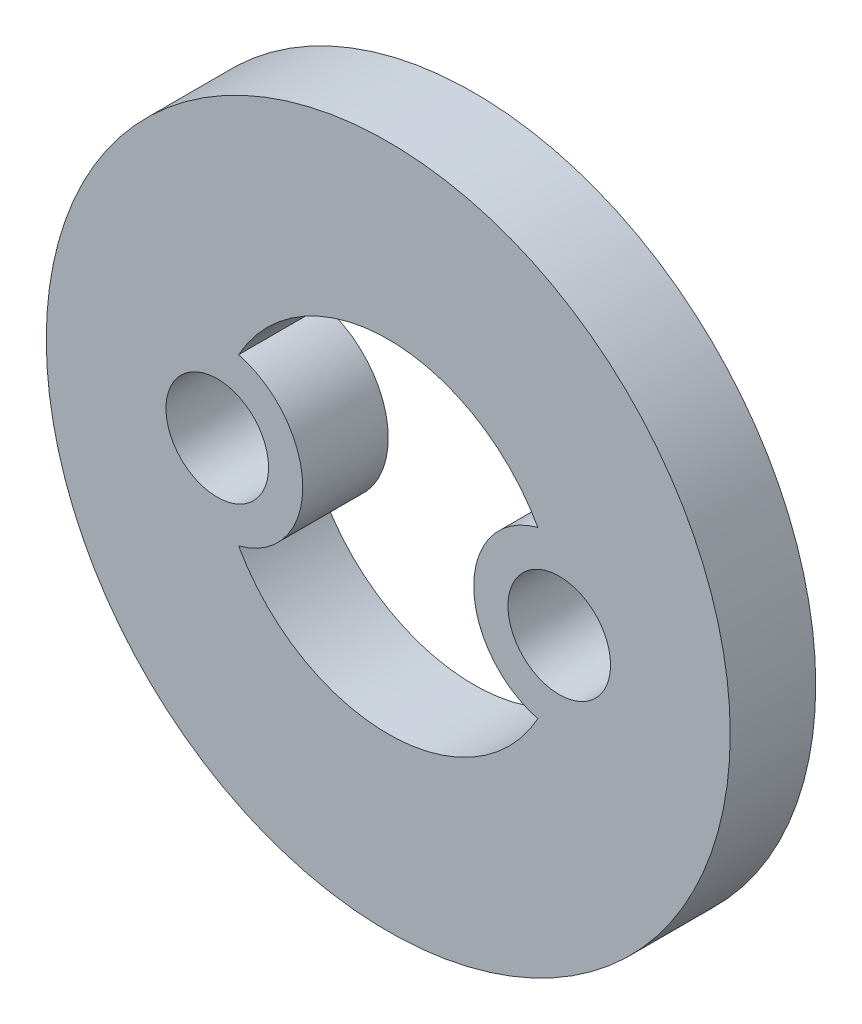
ISO-10303-21;
HEADER;
FILE_DESCRIPTION(('STEP AP214'),'2;1');
FILE_NAME('part.step','',(''),(''),'','','');
FILE_SCHEMA(('AUTOMOTIVE_DESIGN { 1 0 10303 214 1 1 1 1 }'));
ENDSEC;
DATA;
#1=APPLICATION_CONTEXT('core data for automotive mechanical design processes');
#2=APPLICATION_PROTOCOL_DEFINITION('international standard','automotive_design',2000,#1);
#3=PRODUCT_CONTEXT('',#1,'mechanical');
#4=PRODUCT('Part','Part','',(#3));
#5=PRODUCT_RELATED_PRODUCT_CATEGORY('part','',(#4));
#6=PRODUCT_DEFINITION_FORMATION('','',#4);
#7=PRODUCT_DEFINITION_CONTEXT('part definition',#1,'design');
#8=PRODUCT_DEFINITION('design','',#6,#7);
#9=PRODUCT_DEFINITION_SHAPE('','',#8);
#10=(LENGTH_UNIT() NAMED_UNIT(*) SI_UNIT(.MILLI.,.METRE.));
#11=(NAMED_UNIT(*) PLANE_ANGLE_UNIT() SI_UNIT($,.RADIAN.));
#12=(NAMED_UNIT(*) SI_UNIT($,.STERADIAN.) SOLID_ANGLE_UNIT());
#13=UNCERTAINTY_MEASURE_WITH_UNIT(LENGTH_MEASURE(1.E-05),#10,'distance_accuracy_value','');
#14=(GEOMETRIC_REPRESENTATION_CONTEXT(3) GLOBAL_UNCERTAINTY_ASSIGNED_CONTEXT((#13)) GLOBAL_UNIT_ASSIGNED_CONTEXT((#10,
#11,#12)) REPRESENTATION_CONTEXT('',''));
#15=CARTESIAN_POINT('',(0.,0.,0.));
#16=DIRECTION('',(0.,0.,1.));
#17=DIRECTION('',(1.,0.,0.));
#18=AXIS2_PLACEMENT_3D('',#15,#16,#17);
#19=CARTESIAN_POINT('',(0.,0.,5.));
#20=DIRECTION('',(0.,0.,1.));
#21=DIRECTION('',(1.,0.,0.));
#22=AXIS2_PLACEMENT_3D('',#19,#20,#21);
#23=PLANE('',#22);
#24=CARTESIAN_POINT('',(-10.,0.,5.));
#25=DIRECTION('',(0.,0.,1.));
#26=DIRECTION('',(1.,0.,0.));
#27=AXIS2_PLACEMENT_3D('',#24,#25,#26);
#28=CIRCLE('',#27,3.);
#29=CARTESIAN_POINT('',(-7.,0.,5.));
#30=VERTEX_POINT('',#29);
#31=EDGE_CURVE('E109',#30,#30,#28,.T.);
#32=ORIENTED_EDGE('',*,*,#31,.F.);
#33=EDGE_LOOP('',(#32));
#34=FACE_BOUND('',#33,.T.);
#35=CARTESIAN_POINT('',(0.,0.,5.));
#36=DIRECTION('',(0.,0.,1.));
#37=DIRECTION('',(1.,0.,0.));
#38=AXIS2_PLACEMENT_3D('',#35,#36,#37);
#39=CIRCLE('',#38,20.);
#40=CARTESIAN_POINT('',(20.,0.,5.));
#41=VERTEX_POINT('',#40);
#42=EDGE_CURVE('E11',#41,#41,#39,.T.);
#43=ORIENTED_EDGE('',*,*,#42,.T.);
#44=EDGE_LOOP('',(#43));
#45=FACE_BOUND('',#44,.T.);
#46=CARTESIAN_POINT('',(10.,0.,5.));
#47=DIRECTION('',(0.,0.,1.));
#48=DIRECTION('',(1.,0.,0.));
#49=AXIS2_PLACEMENT_3D('',#46,#47,#48);
#50=CIRCLE('',#49,3.);
#51=CARTESIAN_POINT('',(13.,0.,5.));
#52=VERTEX_POINT('',#51);
#53=EDGE_CURVE('E115',#52,#52,#50,.T.);
#54=ORIENTED_EDGE('',*,*,#53,.F.);
#55=EDGE_LOOP('',(#54));
#56=FACE_BOUND('',#55,.T.);
#57=CARTESIAN_POINT('',(10.,0.,5.));
#58=DIRECTION('',(0.,0.,-1.));
#59=DIRECTION('',(1.,0.,0.));
#60=AXIS2_PLACEMENT_3D('',#57,#58,#59);
#61=CIRCLE('',#60,5.);
#62=CARTESIAN_POINT('',(8.75,-4.84122918275927,5.));
#63=VERTEX_POINT('',#62);
#64=CARTESIAN_POINT('',(8.75,4.84122918275927,5.));
#65=VERTEX_POINT('',#64);
#66=EDGE_CURVE('E81',#63,#65,#61,.T.);
#67=ORIENTED_EDGE('',*,*,#66,.F.);
#68=CARTESIAN_POINT('',(0.,0.,5.));
#69=DIRECTION('',(0.,0.,1.));
#70=DIRECTION('',(1.,0.,0.));
#71=AXIS2_PLACEMENT_3D('',#68,#69,#70);
#72=CIRCLE('',#71,10.);
#73=CARTESIAN_POINT('',(-8.75,-4.84122918275927,5.));
#74=VERTEX_POINT('',#73);
#75=EDGE_CURVE('E73',#74,#63,#72,.T.);
#76=ORIENTED_EDGE('',*,*,#75,.F.);
#77=CARTESIAN_POINT('',(-10.,0.,5.));
#78=DIRECTION('',(0.,0.,-1.));
#79=DIRECTION('',(1.,0.,0.));
#80=AXIS2_PLACEMENT_3D('',#77,#78,#79);
#81=CIRCLE('',#80,5.);
#82=CARTESIAN_POINT('',(-8.75,4.84122918275927,5.));
#83=VERTEX_POINT('',#82);
#84=EDGE_CURVE('E95',#83,#74,#81,.T.);
#85=ORIENTED_EDGE('',*,*,#84,.F.);
#86=CARTESIAN_POINT('',(0.,0.,5.));
#87=DIRECTION('',(0.,0.,1.));
#88=DIRECTION('',(1.,0.,0.));
#89=AXIS2_PLACEMENT_3D('',#86,#87,#88);
#90=CIRCLE('',#89,10.);
#91=EDGE_CURVE('E93',#65,#83,#90,.T.);
#92=ORIENTED_EDGE('',*,*,#91,.F.);
#93=EDGE_LOOP('',(#67,#76,#85,#92));
#94=FACE_BOUND('',#93,.T.);
#95=ADVANCED_FACE('F32',(#34,#45,#56,#94),#23,.T.);
#96=CARTESIAN_POINT('',(0.,0.,0.));
#97=DIRECTION('',(0.,0.,1.));
#98=DIRECTION('',(1.,0.,0.));
#99=AXIS2_PLACEMENT_3D('',#96,#97,#98);
#100=PLANE('',#99);
#101=CARTESIAN_POINT('',(-10.,0.,0.));
#102=DIRECTION('',(0.,0.,1.));
#103=DIRECTION('',(1.,0.,0.));
#104=AXIS2_PLACEMENT_3D('',#101,#102,#103);
#105=CIRCLE('',#104,3.);
#106=CARTESIAN_POINT('',(-7.,0.,0.));
#107=VERTEX_POINT('',#106);
#108=EDGE_CURVE('E89',#107,#107,#105,.T.);
#109=ORIENTED_EDGE('',*,*,#108,.T.);
#110=EDGE_LOOP('',(#109));
#111=FACE_BOUND('',#110,.T.);
#112=CARTESIAN_POINT('',(0.,0.,0.));
#113=DIRECTION('',(0.,0.,1.));
#114=DIRECTION('',(1.,0.,0.));
#115=AXIS2_PLACEMENT_3D('',#112,#113,#114);
#116=CIRCLE('',#115,20.);
#117=CARTESIAN_POINT('',(20.,0.,0.));
#118=VERTEX_POINT('',#117);
#119=EDGE_CURVE('E36',#118,#118,#116,.T.);
#120=ORIENTED_EDGE('',*,*,#119,.F.);
#121=EDGE_LOOP('',(#120));
#122=FACE_BOUND('',#121,.T.);
#123=CARTESIAN_POINT('',(10.,0.,0.));
#124=DIRECTION('',(0.,0.,1.));
#125=DIRECTION('',(1.,0.,0.));
#126=AXIS2_PLACEMENT_3D('',#123,#124,#125);
#127=CIRCLE('',#126,3.);
#128=CARTESIAN_POINT('',(13.,0.,0.));
#129=VERTEX_POINT('',#128);
#130=EDGE_CURVE('E112',#129,#129,#127,.T.);
#131=ORIENTED_EDGE('',*,*,#130,.T.);
#132=EDGE_LOOP('',(#131));
#133=FACE_BOUND('',#132,.T.);
#134=CARTESIAN_POINT('',(0.,0.,0.));
#135=DIRECTION('',(0.,0.,1.));
#136=DIRECTION('',(1.,0.,0.));
#137=AXIS2_PLACEMENT_3D('',#134,#135,#136);
#138=CIRCLE('',#137,10.);
#139=CARTESIAN_POINT('',(-8.75,-4.84122918275927,0.));
#140=VERTEX_POINT('',#139);
#141=CARTESIAN_POINT('',(8.75,-4.84122918275927,0.));
#142=VERTEX_POINT('',#141);
#143=EDGE_CURVE('E55',#140,#142,#138,.T.);
#144=ORIENTED_EDGE('',*,*,#143,.T.);
#145=CARTESIAN_POINT('',(10.,0.,0.));
#146=DIRECTION('',(0.,0.,-1.));
#147=DIRECTION('',(1.,0.,0.));
#148=AXIS2_PLACEMENT_3D('',#145,#146,#147);
#149=CIRCLE('',#148,5.);
#150=CARTESIAN_POINT('',(8.75,4.84122918275927,0.));
#151=VERTEX_POINT('',#150);
#152=EDGE_CURVE('E88',#142,#151,#149,.T.);
#153=ORIENTED_EDGE('',*,*,#152,.T.);
#154=CARTESIAN_POINT('',(0.,0.,0.));
#155=DIRECTION('',(0.,0.,1.));
#156=DIRECTION('',(1.,0.,0.));
#157=AXIS2_PLACEMENT_3D('',#154,#155,#156);
#158=CIRCLE('',#157,10.);
#159=CARTESIAN_POINT('',(-8.75,4.84122918275927,0.));
#160=VERTEX_POINT('',#159);
#161=EDGE_CURVE('E101',#151,#160,#158,.T.);
#162=ORIENTED_EDGE('',*,*,#161,.T.);
#163=CARTESIAN_POINT('',(-10.,0.,0.));
#164=DIRECTION('',(0.,0.,-1.));
#165=DIRECTION('',(1.,0.,0.));
#166=AXIS2_PLACEMENT_3D('',#163,#164,#165);
#167=CIRCLE('',#166,5.);
#168=EDGE_CURVE('E82',#160,#140,#167,.T.);
#169=ORIENTED_EDGE('',*,*,#168,.T.);
#170=EDGE_LOOP('',(#144,#153,#162,#169));
#171=FACE_BOUND('',#170,.T.);
#172=ADVANCED_FACE('F121',(#111,#122,#133,#171),#100,.F.);
#173=CARTESIAN_POINT('',(0.,0.,5.));
#174=DIRECTION('',(0.,0.,-1.));
#175=DIRECTION('',(-1.,0.,0.));
#176=AXIS2_PLACEMENT_3D('',#173,#174,#175);
#177=CYLINDRICAL_SURFACE('',#176,20.);
#178=ORIENTED_EDGE('',*,*,#42,.F.);
#179=EDGE_LOOP('',(#178));
#180=FACE_BOUND('',#179,.T.);
#181=ORIENTED_EDGE('',*,*,#119,.T.);
#182=EDGE_LOOP('',(#181));
#183=FACE_BOUND('',#182,.T.);
#184=ADVANCED_FACE('F34',(#180,#183),#177,.T.);
#185=CARTESIAN_POINT('',(10.,0.,5.));
#186=DIRECTION('',(0.,0.,-1.));
#187=DIRECTION('',(-1.,0.,0.));
#188=AXIS2_PLACEMENT_3D('',#185,#186,#187);
#189=CYLINDRICAL_SURFACE('',#188,3.);
#190=ORIENTED_EDGE('',*,*,#53,.T.);
#191=EDGE_LOOP('',(#190));
#192=FACE_BOUND('',#191,.T.);
#193=ORIENTED_EDGE('',*,*,#130,.F.);
#194=EDGE_LOOP('',(#193));
#195=FACE_BOUND('',#194,.T.);
#196=ADVANCED_FACE('F124',(#192,#195),#189,.F.);
#197=CARTESIAN_POINT('',(-10.,0.,5.));
#198=DIRECTION('',(0.,0.,-1.));
#199=DIRECTION('',(-1.,0.,0.));
#200=AXIS2_PLACEMENT_3D('',#197,#198,#199);
#201=CYLINDRICAL_SURFACE('',#200,3.);
#202=ORIENTED_EDGE('',*,*,#31,.T.);
#203=EDGE_LOOP('',(#202));
#204=FACE_BOUND('',#203,.T.);
#205=ORIENTED_EDGE('',*,*,#108,.F.);
#206=EDGE_LOOP('',(#205));
#207=FACE_BOUND('',#206,.T.);
#208=ADVANCED_FACE('F126',(#204,#207),#201,.F.);
#209=CARTESIAN_POINT('',(0.,0.,5.));
#210=DIRECTION('',(0.,0.,-1.));
#211=DIRECTION('',(-1.,0.,0.));
#212=AXIS2_PLACEMENT_3D('',#209,#210,#211);
#213=CYLINDRICAL_SURFACE('',#212,10.);
#214=ORIENTED_EDGE('',*,*,#143,.F.);
#215=DIRECTION('',(0.,0.,-1.));
#216=VECTOR('',#215,1.);
#217=CARTESIAN_POINT('',(-8.75,-4.84122918275927,5.));
#218=LINE('',#217,#216);
#219=EDGE_CURVE('E77',#74,#140,#218,.T.);
#220=ORIENTED_EDGE('',*,*,#219,.F.);
#221=ORIENTED_EDGE('',*,*,#75,.T.);
#222=DIRECTION('',(0.,0.,-1.));
#223=VECTOR('',#222,1.);
#224=CARTESIAN_POINT('',(8.75,-4.84122918275927,5.));
#225=LINE('',#224,#223);
#226=EDGE_CURVE('E76',#63,#142,#225,.T.);
#227=ORIENTED_EDGE('',*,*,#226,.T.);
#228=EDGE_LOOP('',(#214,#220,#221,#227));
#229=FACE_BOUND('',#228,.T.);
#230=ADVANCED_FACE('F75',(#229),#213,.F.);
#231=CARTESIAN_POINT('',(10.,0.,5.));
#232=DIRECTION('',(0.,0.,-1.));
#233=DIRECTION('',(-1.,0.,0.));
#234=AXIS2_PLACEMENT_3D('',#231,#232,#233);
#235=CYLINDRICAL_SURFACE('',#234,5.);
#236=ORIENTED_EDGE('',*,*,#152,.F.);
#237=ORIENTED_EDGE('',*,*,#226,.F.);
#238=ORIENTED_EDGE('',*,*,#66,.T.);
#239=DIRECTION('',(0.,0.,-1.));
#240=VECTOR('',#239,1.);
#241=CARTESIAN_POINT('',(8.75,4.84122918275927,5.));
#242=LINE('',#241,#240);
#243=EDGE_CURVE('E90',#65,#151,#242,.T.);
#244=ORIENTED_EDGE('',*,*,#243,.T.);
#245=EDGE_LOOP('',(#236,#237,#238,#244));
#246=FACE_BOUND('',#245,.T.);
#247=ADVANCED_FACE('F85',(#246),#235,.T.);
#248=CARTESIAN_POINT('',(0.,0.,5.));
#249=DIRECTION('',(0.,0.,-1.));
#250=DIRECTION('',(-1.,0.,0.));
#251=AXIS2_PLACEMENT_3D('',#248,#249,#250);
#252=CYLINDRICAL_SURFACE('',#251,10.);
#253=ORIENTED_EDGE('',*,*,#161,.F.);
#254=ORIENTED_EDGE('',*,*,#243,.F.);
#255=ORIENTED_EDGE('',*,*,#91,.T.);
#256=DIRECTION('',(0.,0.,-1.));
#257=VECTOR('',#256,1.);
#258=CARTESIAN_POINT('',(-8.75,4.84122918275927,5.));
#259=LINE('',#258,#257);
#260=EDGE_CURVE('E47',#83,#160,#259,.T.);
#261=ORIENTED_EDGE('',*,*,#260,.T.);
#262=EDGE_LOOP('',(#253,#254,#255,#261));
#263=FACE_BOUND('',#262,.T.);
#264=ADVANCED_FACE('F187',(#263),#252,.F.);
#265=CARTESIAN_POINT('',(-10.,0.,5.));
#266=DIRECTION('',(0.,0.,-1.));
#267=DIRECTION('',(-1.,0.,0.));
#268=AXIS2_PLACEMENT_3D('',#265,#266,#267);
#269=CYLINDRICAL_SURFACE('',#268,5.);
#270=ORIENTED_EDGE('',*,*,#168,.F.);
#271=ORIENTED_EDGE('',*,*,#260,.F.);
#272=ORIENTED_EDGE('',*,*,#84,.T.);
#273=ORIENTED_EDGE('',*,*,#219,.T.);
#274=EDGE_LOOP('',(#270,#271,#272,#273));
#275=FACE_BOUND('',#274,.T.);
#276=ADVANCED_FACE('F196',(#275),#269,.T.);
#277=CLOSED_SHELL('',(#95,#172,#184,#196,#208,#230,#247,#264,#276));
#278=MANIFOLD_SOLID_BREP('B2',#277);
#279=ADVANCED_BREP_SHAPE_REPRESENTATION('',(#18,#278),#14);
#280=SHAPE_DEFINITION_REPRESENTATION(#9,#279);
ENDSEC;
END-ISO-10303-21;
